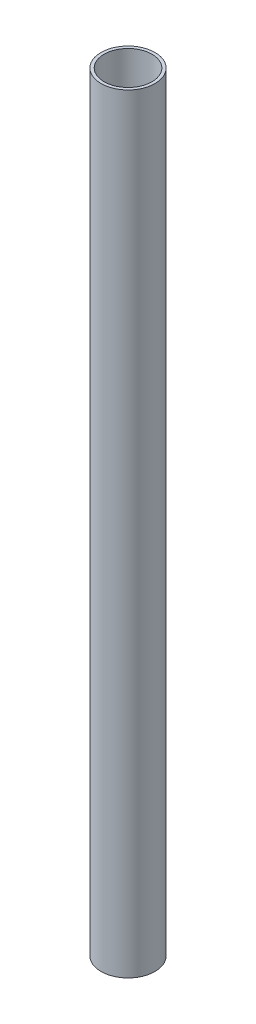
ISO-10303-21;
HEADER;
FILE_DESCRIPTION(('STEP AP214'),'2;1');
FILE_NAME('part.step','',(''),(''),'','','');
FILE_SCHEMA(('AUTOMOTIVE_DESIGN { 1 0 10303 214 1 1 1 1 }'));
ENDSEC;
DATA;
#1=APPLICATION_CONTEXT('core data for automotive mechanical design processes');
#2=APPLICATION_PROTOCOL_DEFINITION('international standard','automotive_design',2000,#1);
#3=PRODUCT_CONTEXT('',#1,'mechanical');
#4=PRODUCT('Part','Part','',(#3));
#5=PRODUCT_RELATED_PRODUCT_CATEGORY('part','',(#4));
#6=PRODUCT_DEFINITION_FORMATION('','',#4);
#7=PRODUCT_DEFINITION_CONTEXT('part definition',#1,'design');
#8=PRODUCT_DEFINITION('design','',#6,#7);
#9=PRODUCT_DEFINITION_SHAPE('','',#8);
#10=(LENGTH_UNIT() NAMED_UNIT(*) SI_UNIT(.MILLI.,.METRE.));
#11=(NAMED_UNIT(*) PLANE_ANGLE_UNIT() SI_UNIT($,.RADIAN.));
#12=(NAMED_UNIT(*) SI_UNIT($,.STERADIAN.) SOLID_ANGLE_UNIT());
#13=UNCERTAINTY_MEASURE_WITH_UNIT(LENGTH_MEASURE(1.E-05),#10,'distance_accuracy_value','');
#14=(GEOMETRIC_REPRESENTATION_CONTEXT(3) GLOBAL_UNCERTAINTY_ASSIGNED_CONTEXT((#13)) GLOBAL_UNIT_ASSIGNED_CONTEXT((#10,
#11,#12)) REPRESENTATION_CONTEXT('',''));
#15=CARTESIAN_POINT('',(0.,0.,0.));
#16=DIRECTION('',(0.,0.,1.));
#17=DIRECTION('',(1.,0.,0.));
#18=AXIS2_PLACEMENT_3D('',#15,#16,#17);
#19=CARTESIAN_POINT('',(13.6326591615901,226.52,-6.07942908557396));
#20=DIRECTION('',(0.,1.,0.));
#21=DIRECTION('',(0.,0.,1.));
#22=AXIS2_PLACEMENT_3D('',#19,#20,#21);
#23=PLANE('',#22);
#24=CARTESIAN_POINT('',(13.6326591615901,226.52,-6.07942908557396));
#25=DIRECTION('',(0.,1.,0.));
#26=DIRECTION('',(0.,0.,1.));
#27=AXIS2_PLACEMENT_3D('',#24,#25,#26);
#28=CIRCLE('',#27,7.9375);
#29=CARTESIAN_POINT('',(13.6326591615901,226.52,-14.016929085574));
#30=VERTEX_POINT('',#29);
#31=EDGE_CURVE('E10',#30,#30,#28,.T.);
#32=ORIENTED_EDGE('',*,*,#31,.T.);
#33=EDGE_LOOP('',(#32));
#34=FACE_BOUND('',#33,.T.);
#35=CARTESIAN_POINT('',(13.6326591615901,226.52,-6.07942908557396));
#36=DIRECTION('',(0.,1.,0.));
#37=DIRECTION('',(0.,0.,1.));
#38=AXIS2_PLACEMENT_3D('',#35,#36,#37);
#39=CIRCLE('',#38,7.0485);
#40=CARTESIAN_POINT('',(13.6326591615901,226.52,-13.127929085574));
#41=VERTEX_POINT('',#40);
#42=EDGE_CURVE('E44',#41,#41,#39,.T.);
#43=ORIENTED_EDGE('',*,*,#42,.F.);
#44=EDGE_LOOP('',(#43));
#45=FACE_BOUND('',#44,.T.);
#46=ADVANCED_FACE('F33',(#34,#45),#23,.T.);
#47=CARTESIAN_POINT('',(13.6326591615901,0.,-6.07942908557396));
#48=DIRECTION('',(0.,1.,0.));
#49=DIRECTION('',(0.,0.,1.));
#50=AXIS2_PLACEMENT_3D('',#47,#48,#49);
#51=PLANE('',#50);
#52=CARTESIAN_POINT('',(13.6326591615901,0.,-6.07942908557396));
#53=DIRECTION('',(0.,1.,0.));
#54=DIRECTION('',(0.,0.,1.));
#55=AXIS2_PLACEMENT_3D('',#52,#53,#54);
#56=CIRCLE('',#55,7.9375);
#57=CARTESIAN_POINT('',(13.6326591615901,0.,-14.016929085574));
#58=VERTEX_POINT('',#57);
#59=EDGE_CURVE('E37',#58,#58,#56,.T.);
#60=ORIENTED_EDGE('',*,*,#59,.F.);
#61=EDGE_LOOP('',(#60));
#62=FACE_BOUND('',#61,.T.);
#63=CARTESIAN_POINT('',(13.6326591615901,0.,-6.07942908557396));
#64=DIRECTION('',(0.,1.,0.));
#65=DIRECTION('',(0.,0.,1.));
#66=AXIS2_PLACEMENT_3D('',#63,#64,#65);
#67=CIRCLE('',#66,7.0485);
#68=CARTESIAN_POINT('',(13.6326591615901,0.,-13.127929085574));
#69=VERTEX_POINT('',#68);
#70=EDGE_CURVE('E46',#69,#69,#67,.T.);
#71=ORIENTED_EDGE('',*,*,#70,.T.);
#72=EDGE_LOOP('',(#71));
#73=FACE_BOUND('',#72,.T.);
#74=ADVANCED_FACE('F56',(#62,#73),#51,.F.);
#75=CARTESIAN_POINT('',(13.6326591615901,226.52,-6.07942908557396));
#76=DIRECTION('',(0.,-1.,0.));
#77=DIRECTION('',(0.,0.,-1.));
#78=AXIS2_PLACEMENT_3D('',#75,#76,#77);
#79=CYLINDRICAL_SURFACE('',#78,7.9375);
#80=CARTESIAN_POINT('',(13.6326591615901,226.52,-14.016929085574));
#81=CARTESIAN_POINT('',(13.6326591615901,224.160416666667,-14.016929085574));
#82=CARTESIAN_POINT('',(13.6326591615901,221.800833333333,-14.016929085574));
#83=CARTESIAN_POINT('',(13.6326591615901,217.081666666667,-14.016929085574));
#84=CARTESIAN_POINT('',(13.6326591615901,214.722083333333,-14.016929085574));
#85=CARTESIAN_POINT('',(13.6326591615901,210.002916666667,-14.016929085574));
#86=CARTESIAN_POINT('',(13.6326591615901,207.643333333333,-14.016929085574));
#87=CARTESIAN_POINT('',(13.6326591615901,202.924166666667,-14.016929085574));
#88=CARTESIAN_POINT('',(13.6326591615901,200.564583333333,-14.016929085574));
#89=CARTESIAN_POINT('',(13.6326591615901,195.845416666667,-14.016929085574));
#90=CARTESIAN_POINT('',(13.6326591615901,193.485833333333,-14.016929085574));
#91=CARTESIAN_POINT('',(13.6326591615901,188.766666666667,-14.016929085574));
#92=CARTESIAN_POINT('',(13.6326591615901,186.407083333333,-14.016929085574));
#93=CARTESIAN_POINT('',(13.6326591615901,181.687916666667,-14.016929085574));
#94=CARTESIAN_POINT('',(13.6326591615901,179.328333333333,-14.016929085574));
#95=CARTESIAN_POINT('',(13.6326591615901,174.609166666667,-14.016929085574));
#96=CARTESIAN_POINT('',(13.6326591615901,172.249583333333,-14.016929085574));
#97=CARTESIAN_POINT('',(13.6326591615901,167.530416666667,-14.016929085574));
#98=CARTESIAN_POINT('',(13.6326591615901,165.170833333333,-14.016929085574));
#99=CARTESIAN_POINT('',(13.6326591615901,160.451666666667,-14.016929085574));
#100=CARTESIAN_POINT('',(13.6326591615901,158.092083333333,-14.016929085574));
#101=CARTESIAN_POINT('',(13.6326591615901,153.372916666667,-14.016929085574));
#102=CARTESIAN_POINT('',(13.6326591615901,151.013333333333,-14.016929085574));
#103=CARTESIAN_POINT('',(13.6326591615901,146.294166666667,-14.016929085574));
#104=CARTESIAN_POINT('',(13.6326591615901,143.934583333333,-14.016929085574));
#105=CARTESIAN_POINT('',(13.6326591615901,139.215416666667,-14.016929085574));
#106=CARTESIAN_POINT('',(13.6326591615901,136.855833333333,-14.016929085574));
#107=CARTESIAN_POINT('',(13.6326591615901,132.136666666667,-14.016929085574));
#108=CARTESIAN_POINT('',(13.6326591615901,129.777083333333,-14.016929085574));
#109=CARTESIAN_POINT('',(13.6326591615901,125.057916666667,-14.016929085574));
#110=CARTESIAN_POINT('',(13.6326591615901,122.698333333333,-14.016929085574));
#111=CARTESIAN_POINT('',(13.6326591615901,117.979166666667,-14.016929085574));
#112=CARTESIAN_POINT('',(13.6326591615901,115.619583333333,-14.016929085574));
#113=CARTESIAN_POINT('',(13.6326591615901,110.900416666667,-14.016929085574));
#114=CARTESIAN_POINT('',(13.6326591615901,108.540833333333,-14.016929085574));
#115=CARTESIAN_POINT('',(13.6326591615901,103.821666666667,-14.016929085574));
#116=CARTESIAN_POINT('',(13.6326591615901,101.462083333333,-14.016929085574));
#117=CARTESIAN_POINT('',(13.6326591615901,96.7429166666666,-14.016929085574));
#118=CARTESIAN_POINT('',(13.6326591615901,94.3833333333333,-14.016929085574));
#119=CARTESIAN_POINT('',(13.6326591615901,89.6641666666667,-14.016929085574));
#120=CARTESIAN_POINT('',(13.6326591615901,87.3045833333333,-14.016929085574));
#121=CARTESIAN_POINT('',(13.6326591615901,82.5854166666666,-14.016929085574));
#122=CARTESIAN_POINT('',(13.6326591615901,80.2258333333333,-14.016929085574));
#123=CARTESIAN_POINT('',(13.6326591615901,75.5066666666666,-14.016929085574));
#124=CARTESIAN_POINT('',(13.6326591615901,73.1470833333333,-14.016929085574));
#125=CARTESIAN_POINT('',(13.6326591615901,68.4279166666666,-14.016929085574));
#126=CARTESIAN_POINT('',(13.6326591615901,66.0683333333333,-14.016929085574));
#127=CARTESIAN_POINT('',(13.6326591615901,61.3491666666666,-14.016929085574));
#128=CARTESIAN_POINT('',(13.6326591615901,58.9895833333333,-14.016929085574));
#129=CARTESIAN_POINT('',(13.6326591615901,54.2704166666667,-14.016929085574));
#130=CARTESIAN_POINT('',(13.6326591615901,51.9108333333333,-14.016929085574));
#131=CARTESIAN_POINT('',(13.6326591615901,47.1916666666667,-14.016929085574));
#132=CARTESIAN_POINT('',(13.6326591615901,44.8320833333333,-14.016929085574));
#133=CARTESIAN_POINT('',(13.6326591615901,40.1129166666666,-14.016929085574));
#134=CARTESIAN_POINT('',(13.6326591615901,37.7533333333333,-14.016929085574));
#135=CARTESIAN_POINT('',(13.6326591615901,33.0341666666666,-14.016929085574));
#136=CARTESIAN_POINT('',(13.6326591615901,30.6745833333333,-14.016929085574));
#137=CARTESIAN_POINT('',(13.6326591615901,25.9554166666666,-14.016929085574));
#138=CARTESIAN_POINT('',(13.6326591615901,23.5958333333333,-14.016929085574));
#139=CARTESIAN_POINT('',(13.6326591615901,18.8766666666666,-14.016929085574));
#140=CARTESIAN_POINT('',(13.6326591615901,16.5170833333333,-14.016929085574));
#141=CARTESIAN_POINT('',(13.6326591615901,11.7979166666666,-14.016929085574));
#142=CARTESIAN_POINT('',(13.6326591615901,9.4383333333333,-14.016929085574));
#143=CARTESIAN_POINT('',(13.6326591615901,4.71916666666664,-14.016929085574));
#144=CARTESIAN_POINT('',(13.6326591615901,2.35958333333331,-14.016929085574));
#145=CARTESIAN_POINT('',(13.6326591615901,0.,-14.016929085574));
#146=B_SPLINE_CURVE_WITH_KNOTS('',3,(#80,#81,#82,#83,#84,#85,#86,#87,#88,#89,#90,#91,#92,#93,
#94,#95,#96,#97,#98,#99,#100,#101,#102,#103,#104,#105,#106,#107,#108,#109,#110,#111,#112,#113,
#114,#115,#116,#117,#118,#119,#120,#121,#122,#123,#124,#125,#126,#127,#128,#129,#130,#131,#132,
#133,#134,#135,#136,#137,#138,#139,#140,#141,#142,#143,#144,#145),.UNSPECIFIED.,.F.,.F.,(4,2,2,
2,2,2,2,2,2,2,2,2,2,2,2,2,2,2,2,2,2,2,2,2,2,2,2,2,2,2,2,2,4),(0.,7.07874999999999,14.1575,
21.23625,28.315,35.39375,42.4725,49.55125,56.63,63.70875,70.7875,77.86625,84.945,92.02375,
99.1025,106.18125,113.26,120.33875,127.4175,134.49625,141.575,148.65375,155.7325,162.81125,
169.89,176.96875,184.0475,191.12625,198.205,205.28375,212.3625,219.44125,226.52),.UNSPECIFIED.);
#147=EDGE_CURVE('BSEAM35',#30,#58,#146,.T.);
#148=ORIENTED_EDGE('',*,*,#31,.F.);
#149=ORIENTED_EDGE('',*,*,#59,.T.);
#150=ORIENTED_EDGE('',*,*,#147,.T.);
#151=ORIENTED_EDGE('',*,*,#147,.F.);
#152=EDGE_LOOP('',(#148,#150,#149,#151));
#153=FACE_BOUND('',#152,.T.);
#154=ADVANCED_FACE('F35',(#153),#79,.T.);
#155=CARTESIAN_POINT('',(13.6326591615901,226.52,-6.07942908557396));
#156=DIRECTION('',(0.,-1.,0.));
#157=DIRECTION('',(0.,0.,-1.));
#158=AXIS2_PLACEMENT_3D('',#155,#156,#157);
#159=CYLINDRICAL_SURFACE('',#158,7.0485);
#160=CARTESIAN_POINT('',(13.6326591615901,226.52,-13.127929085574));
#161=CARTESIAN_POINT('',(13.6326591615901,224.160416666667,-13.127929085574));
#162=CARTESIAN_POINT('',(13.6326591615901,221.800833333333,-13.127929085574));
#163=CARTESIAN_POINT('',(13.6326591615901,217.081666666667,-13.127929085574));
#164=CARTESIAN_POINT('',(13.6326591615901,214.722083333333,-13.127929085574));
#165=CARTESIAN_POINT('',(13.6326591615901,210.002916666667,-13.127929085574));
#166=CARTESIAN_POINT('',(13.6326591615901,207.643333333333,-13.127929085574));
#167=CARTESIAN_POINT('',(13.6326591615901,202.924166666667,-13.127929085574));
#168=CARTESIAN_POINT('',(13.6326591615901,200.564583333333,-13.127929085574));
#169=CARTESIAN_POINT('',(13.6326591615901,195.845416666667,-13.127929085574));
#170=CARTESIAN_POINT('',(13.6326591615901,193.485833333333,-13.127929085574));
#171=CARTESIAN_POINT('',(13.6326591615901,188.766666666667,-13.127929085574));
#172=CARTESIAN_POINT('',(13.6326591615901,186.407083333333,-13.127929085574));
#173=CARTESIAN_POINT('',(13.6326591615901,181.687916666667,-13.127929085574));
#174=CARTESIAN_POINT('',(13.6326591615901,179.328333333333,-13.127929085574));
#175=CARTESIAN_POINT('',(13.6326591615901,174.609166666667,-13.127929085574));
#176=CARTESIAN_POINT('',(13.6326591615901,172.249583333333,-13.127929085574));
#177=CARTESIAN_POINT('',(13.6326591615901,167.530416666667,-13.127929085574));
#178=CARTESIAN_POINT('',(13.6326591615901,165.170833333333,-13.127929085574));
#179=CARTESIAN_POINT('',(13.6326591615901,160.451666666667,-13.127929085574));
#180=CARTESIAN_POINT('',(13.6326591615901,158.092083333333,-13.127929085574));
#181=CARTESIAN_POINT('',(13.6326591615901,153.372916666667,-13.127929085574));
#182=CARTESIAN_POINT('',(13.6326591615901,151.013333333333,-13.127929085574));
#183=CARTESIAN_POINT('',(13.6326591615901,146.294166666667,-13.127929085574));
#184=CARTESIAN_POINT('',(13.6326591615901,143.934583333333,-13.127929085574));
#185=CARTESIAN_POINT('',(13.6326591615901,139.215416666667,-13.127929085574));
#186=CARTESIAN_POINT('',(13.6326591615901,136.855833333333,-13.127929085574));
#187=CARTESIAN_POINT('',(13.6326591615901,132.136666666667,-13.127929085574));
#188=CARTESIAN_POINT('',(13.6326591615901,129.777083333333,-13.127929085574));
#189=CARTESIAN_POINT('',(13.6326591615901,125.057916666667,-13.127929085574));
#190=CARTESIAN_POINT('',(13.6326591615901,122.698333333333,-13.127929085574));
#191=CARTESIAN_POINT('',(13.6326591615901,117.979166666667,-13.127929085574));
#192=CARTESIAN_POINT('',(13.6326591615901,115.619583333333,-13.127929085574));
#193=CARTESIAN_POINT('',(13.6326591615901,110.900416666667,-13.127929085574));
#194=CARTESIAN_POINT('',(13.6326591615901,108.540833333333,-13.127929085574));
#195=CARTESIAN_POINT('',(13.6326591615901,103.821666666667,-13.127929085574));
#196=CARTESIAN_POINT('',(13.6326591615901,101.462083333333,-13.127929085574));
#197=CARTESIAN_POINT('',(13.6326591615901,96.7429166666666,-13.127929085574));
#198=CARTESIAN_POINT('',(13.6326591615901,94.3833333333333,-13.127929085574));
#199=CARTESIAN_POINT('',(13.6326591615901,89.6641666666667,-13.127929085574));
#200=CARTESIAN_POINT('',(13.6326591615901,87.3045833333333,-13.127929085574));
#201=CARTESIAN_POINT('',(13.6326591615901,82.5854166666666,-13.127929085574));
#202=CARTESIAN_POINT('',(13.6326591615901,80.2258333333333,-13.127929085574));
#203=CARTESIAN_POINT('',(13.6326591615901,75.5066666666666,-13.127929085574));
#204=CARTESIAN_POINT('',(13.6326591615901,73.1470833333333,-13.127929085574));
#205=CARTESIAN_POINT('',(13.6326591615901,68.4279166666666,-13.127929085574));
#206=CARTESIAN_POINT('',(13.6326591615901,66.0683333333333,-13.127929085574));
#207=CARTESIAN_POINT('',(13.6326591615901,61.3491666666666,-13.127929085574));
#208=CARTESIAN_POINT('',(13.6326591615901,58.9895833333333,-13.127929085574));
#209=CARTESIAN_POINT('',(13.6326591615901,54.2704166666667,-13.127929085574));
#210=CARTESIAN_POINT('',(13.6326591615901,51.9108333333333,-13.127929085574));
#211=CARTESIAN_POINT('',(13.6326591615901,47.1916666666667,-13.127929085574));
#212=CARTESIAN_POINT('',(13.6326591615901,44.8320833333333,-13.127929085574));
#213=CARTESIAN_POINT('',(13.6326591615901,40.1129166666666,-13.127929085574));
#214=CARTESIAN_POINT('',(13.6326591615901,37.7533333333333,-13.127929085574));
#215=CARTESIAN_POINT('',(13.6326591615901,33.0341666666666,-13.127929085574));
#216=CARTESIAN_POINT('',(13.6326591615901,30.6745833333333,-13.127929085574));
#217=CARTESIAN_POINT('',(13.6326591615901,25.9554166666666,-13.127929085574));
#218=CARTESIAN_POINT('',(13.6326591615901,23.5958333333333,-13.127929085574));
#219=CARTESIAN_POINT('',(13.6326591615901,18.8766666666666,-13.127929085574));
#220=CARTESIAN_POINT('',(13.6326591615901,16.5170833333333,-13.127929085574));
#221=CARTESIAN_POINT('',(13.6326591615901,11.7979166666666,-13.127929085574));
#222=CARTESIAN_POINT('',(13.6326591615901,9.4383333333333,-13.127929085574));
#223=CARTESIAN_POINT('',(13.6326591615901,4.71916666666664,-13.127929085574));
#224=CARTESIAN_POINT('',(13.6326591615901,2.35958333333331,-13.127929085574));
#225=CARTESIAN_POINT('',(13.6326591615901,0.,-13.127929085574));
#226=B_SPLINE_CURVE_WITH_KNOTS('',3,(#160,#161,#162,#163,#164,#165,#166,#167,#168,#169,#170,
#171,#172,#173,#174,#175,#176,#177,#178,#179,#180,#181,#182,#183,#184,#185,#186,#187,#188,#189,
#190,#191,#192,#193,#194,#195,#196,#197,#198,#199,#200,#201,#202,#203,#204,#205,#206,#207,#208,
#209,#210,#211,#212,#213,#214,#215,#216,#217,#218,#219,#220,#221,#222,#223,#224,#225),
.UNSPECIFIED.,.F.,.F.,(4,2,2,2,2,2,2,2,2,2,2,2,2,2,2,2,2,2,2,2,2,2,2,2,2,2,2,2,2,2,2,2,4),(0.,
7.07874999999999,14.1575,21.23625,28.315,35.39375,42.4725,49.55125,56.63,63.70875,70.7875,
77.86625,84.945,92.02375,99.1025,106.18125,113.26,120.33875,127.4175,134.49625,141.575,
148.65375,155.7325,162.81125,169.89,176.96875,184.0475,191.12625,198.205,205.28375,212.3625,
219.44125,226.52),.UNSPECIFIED.);
#227=EDGE_CURVE('BSEAM52',#41,#69,#226,.T.);
#228=ORIENTED_EDGE('',*,*,#42,.T.);
#229=ORIENTED_EDGE('',*,*,#70,.F.);
#230=ORIENTED_EDGE('',*,*,#227,.T.);
#231=ORIENTED_EDGE('',*,*,#227,.F.);
#232=EDGE_LOOP('',(#228,#230,#229,#231));
#233=FACE_BOUND('',#232,.T.);
#234=ADVANCED_FACE('F52',(#233),#159,.F.);
#235=CLOSED_SHELL('',(#46,#74,#154,#234));
#236=MANIFOLD_SOLID_BREP('B2',#235);
#237=ADVANCED_BREP_SHAPE_REPRESENTATION('',(#18,#236),#14);
#238=SHAPE_DEFINITION_REPRESENTATION(#9,#237);
ENDSEC;
END-ISO-10303-21;
